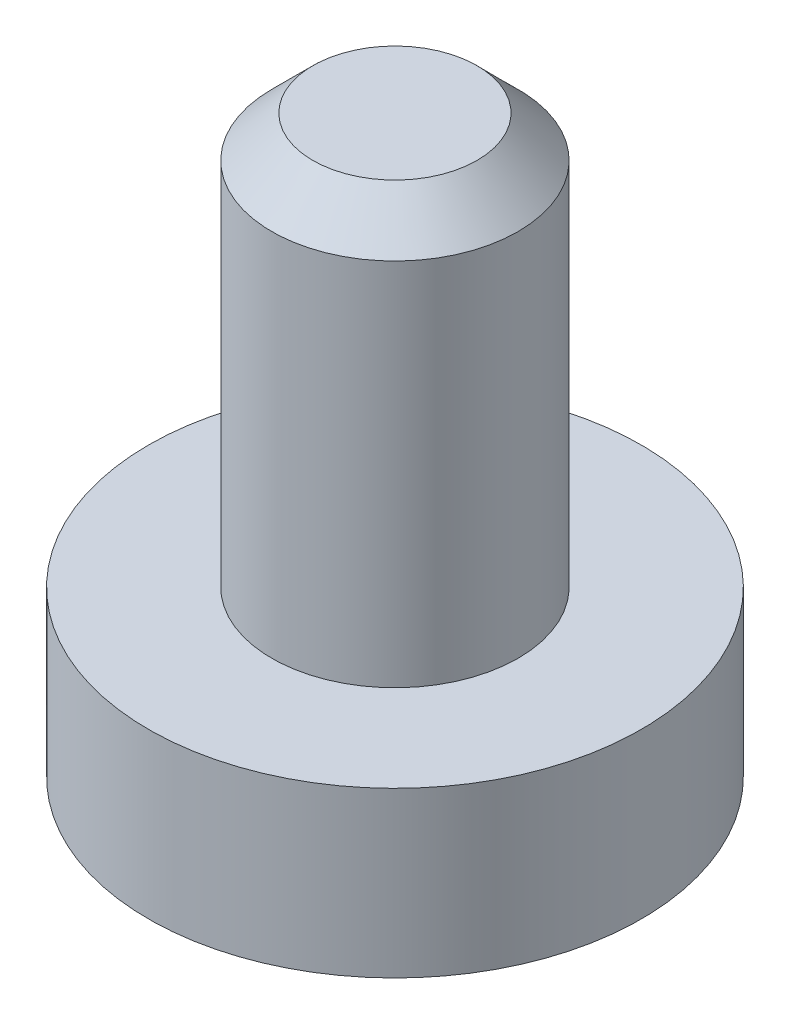
ISO-10303-21;
HEADER;
FILE_DESCRIPTION(('STEP AP214'),'2;1');
FILE_NAME('part.step','',(''),(''),'','','');
FILE_SCHEMA(('AUTOMOTIVE_DESIGN { 1 0 10303 214 1 1 1 1 }'));
ENDSEC;
DATA;
#1=APPLICATION_CONTEXT('core data for automotive mechanical design processes');
#2=APPLICATION_PROTOCOL_DEFINITION('international standard','automotive_design',2000,#1);
#3=PRODUCT_CONTEXT('',#1,'mechanical');
#4=PRODUCT('Part','Part','',(#3));
#5=PRODUCT_RELATED_PRODUCT_CATEGORY('part','',(#4));
#6=PRODUCT_DEFINITION_FORMATION('','',#4);
#7=PRODUCT_DEFINITION_CONTEXT('part definition',#1,'design');
#8=PRODUCT_DEFINITION('design','',#6,#7);
#9=PRODUCT_DEFINITION_SHAPE('','',#8);
#10=(LENGTH_UNIT() NAMED_UNIT(*) SI_UNIT(.MILLI.,.METRE.));
#11=(NAMED_UNIT(*) PLANE_ANGLE_UNIT() SI_UNIT($,.RADIAN.));
#12=(NAMED_UNIT(*) SI_UNIT($,.STERADIAN.) SOLID_ANGLE_UNIT());
#13=UNCERTAINTY_MEASURE_WITH_UNIT(LENGTH_MEASURE(1.E-05),#10,'distance_accuracy_value','');
#14=(GEOMETRIC_REPRESENTATION_CONTEXT(3) GLOBAL_UNCERTAINTY_ASSIGNED_CONTEXT((#13)) GLOBAL_UNIT_ASSIGNED_CONTEXT((#10,
#11,#12)) REPRESENTATION_CONTEXT('',''));
#15=CARTESIAN_POINT('',(0.,0.,0.));
#16=DIRECTION('',(0.,0.,1.));
#17=DIRECTION('',(1.,0.,0.));
#18=AXIS2_PLACEMENT_3D('',#15,#16,#17);
#19=CARTESIAN_POINT('',(0.,0.,0.));
#20=DIRECTION('',(0.,1.,0.));
#21=DIRECTION('',(-1.,0.,0.));
#22=AXIS2_PLACEMENT_3D('',#19,#20,#21);
#23=PLANE('',#22);
#24=CARTESIAN_POINT('',(0.,0.,0.));
#25=DIRECTION('',(0.,1.,0.));
#26=DIRECTION('',(-1.,0.,0.));
#27=AXIS2_PLACEMENT_3D('',#24,#25,#26);
#28=CIRCLE('',#27,3.);
#29=CARTESIAN_POINT('',(-3.,0.,0.));
#30=VERTEX_POINT('',#29);
#31=EDGE_CURVE('E42',#30,#30,#28,.T.);
#32=ORIENTED_EDGE('',*,*,#31,.F.);
#33=EDGE_LOOP('',(#32));
#34=FACE_BOUND('',#33,.T.);
#35=ADVANCED_FACE('F31',(#34),#23,.F.);
#36=CARTESIAN_POINT('',(0.,7.,0.));
#37=DIRECTION('',(0.,1.,0.));
#38=DIRECTION('',(-1.,0.,0.));
#39=AXIS2_PLACEMENT_3D('',#36,#37,#38);
#40=CYLINDRICAL_SURFACE('',#39,3.);
#41=CARTESIAN_POINT('',(0.,2.,0.));
#42=DIRECTION('',(0.,1.,0.));
#43=DIRECTION('',(-1.,0.,0.));
#44=AXIS2_PLACEMENT_3D('',#41,#42,#43);
#45=CIRCLE('',#44,3.);
#46=CARTESIAN_POINT('',(-3.,2.,0.));
#47=VERTEX_POINT('',#46);
#48=EDGE_CURVE('E46',#47,#47,#45,.T.);
#49=ORIENTED_EDGE('',*,*,#48,.F.);
#50=EDGE_LOOP('',(#49));
#51=FACE_BOUND('',#50,.T.);
#52=ORIENTED_EDGE('',*,*,#31,.T.);
#53=EDGE_LOOP('',(#52));
#54=FACE_BOUND('',#53,.T.);
#55=ADVANCED_FACE('F60',(#51,#54),#40,.T.);
#56=CARTESIAN_POINT('',(3.,2.,0.));
#57=DIRECTION('',(0.,-1.,0.));
#58=DIRECTION('',(1.,0.,0.));
#59=AXIS2_PLACEMENT_3D('',#56,#57,#58);
#60=PLANE('',#59);
#61=CARTESIAN_POINT('',(0.,2.,0.));
#62=DIRECTION('',(0.,1.,0.));
#63=DIRECTION('',(-1.,0.,0.));
#64=AXIS2_PLACEMENT_3D('',#61,#62,#63);
#65=CIRCLE('',#64,1.5);
#66=CARTESIAN_POINT('',(-1.5,2.,0.));
#67=VERTEX_POINT('',#66);
#68=EDGE_CURVE('E51',#67,#67,#65,.T.);
#69=ORIENTED_EDGE('',*,*,#68,.F.);
#70=EDGE_LOOP('',(#69));
#71=FACE_BOUND('',#70,.T.);
#72=ORIENTED_EDGE('',*,*,#48,.T.);
#73=EDGE_LOOP('',(#72));
#74=FACE_BOUND('',#73,.T.);
#75=ADVANCED_FACE('F57',(#71,#74),#60,.F.);
#76=CARTESIAN_POINT('',(0.,7.,0.));
#77=DIRECTION('',(0.,1.,0.));
#78=DIRECTION('',(-1.,0.,0.));
#79=AXIS2_PLACEMENT_3D('',#76,#77,#78);
#80=CYLINDRICAL_SURFACE('',#79,1.5);
#81=CARTESIAN_POINT('',(0.,6.5,0.));
#82=DIRECTION('',(0.,-1.,0.));
#83=DIRECTION('',(1.,0.,0.));
#84=AXIS2_PLACEMENT_3D('',#81,#82,#83);
#85=CIRCLE('',#84,1.5);
#86=CARTESIAN_POINT('',(1.5,6.5,0.));
#87=VERTEX_POINT('',#86);
#88=EDGE_CURVE('E10',#87,#87,#85,.T.);
#89=ORIENTED_EDGE('',*,*,#88,.T.);
#90=EDGE_LOOP('',(#89));
#91=FACE_BOUND('',#90,.T.);
#92=ORIENTED_EDGE('',*,*,#68,.T.);
#93=EDGE_LOOP('',(#92));
#94=FACE_BOUND('',#93,.T.);
#95=ADVANCED_FACE('F55',(#91,#94),#80,.T.);
#96=CARTESIAN_POINT('',(1.5,7.,0.));
#97=DIRECTION('',(0.,-1.,0.));
#98=DIRECTION('',(1.,0.,0.));
#99=AXIS2_PLACEMENT_3D('',#96,#97,#98);
#100=PLANE('',#99);
#101=CARTESIAN_POINT('',(0.,7.,0.));
#102=DIRECTION('',(0.,-1.,0.));
#103=DIRECTION('',(1.,0.,0.));
#104=AXIS2_PLACEMENT_3D('',#101,#102,#103);
#105=CIRCLE('',#104,1.);
#106=CARTESIAN_POINT('',(1.,7.,0.));
#107=VERTEX_POINT('',#106);
#108=EDGE_CURVE('E38',#107,#107,#105,.F.);
#109=ORIENTED_EDGE('',*,*,#108,.T.);
#110=EDGE_LOOP('',(#109));
#111=FACE_BOUND('',#110,.T.);
#112=ADVANCED_FACE('F75',(#111),#100,.F.);
#113=CARTESIAN_POINT('',(0.,7.,0.));
#114=DIRECTION('',(0.,-1.,0.));
#115=DIRECTION('',(1.,0.,0.));
#116=AXIS2_PLACEMENT_3D('',#113,#114,#115);
#117=CONICAL_SURFACE('',#116,1.,0.785398163397446);
#118=ORIENTED_EDGE('',*,*,#88,.F.);
#119=EDGE_LOOP('',(#118));
#120=FACE_BOUND('',#119,.T.);
#121=ORIENTED_EDGE('',*,*,#108,.F.);
#122=EDGE_LOOP('',(#121));
#123=FACE_BOUND('',#122,.T.);
#124=ADVANCED_FACE('F33',(#120,#123),#117,.T.);
#125=CLOSED_SHELL('',(#35,#55,#75,#95,#112,#124));
#126=MANIFOLD_SOLID_BREP('B2',#125);
#127=ADVANCED_BREP_SHAPE_REPRESENTATION('',(#18,#126),#14);
#128=SHAPE_DEFINITION_REPRESENTATION(#9,#127);
ENDSEC;
END-ISO-10303-21;
